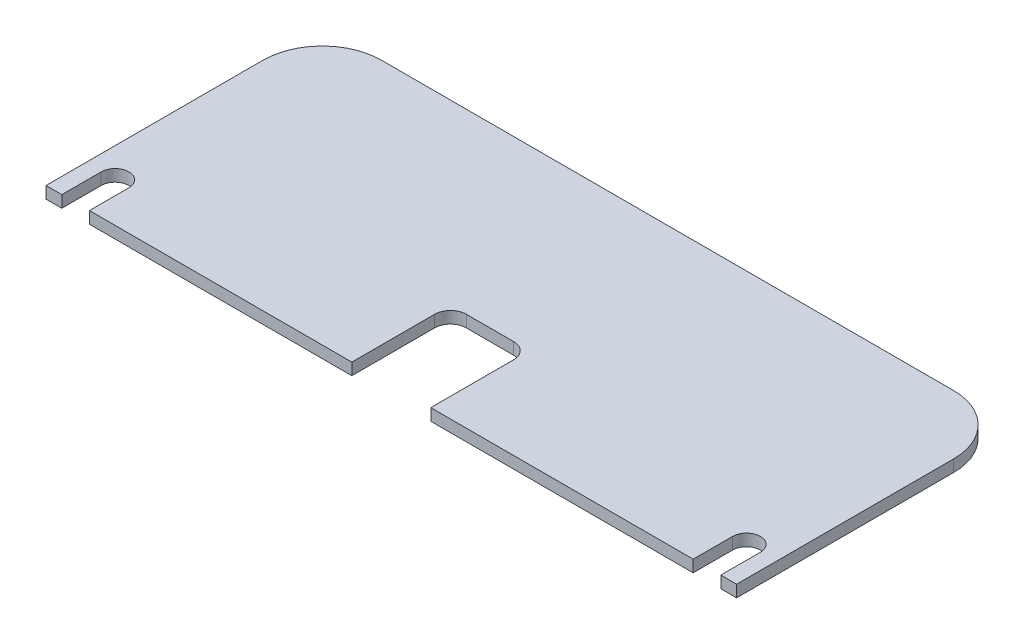
ISO-10303-21;
HEADER;
FILE_DESCRIPTION(('STEP AP214'),'2;1');
FILE_NAME('part.step','',(''),(''),'','','');
FILE_SCHEMA(('AUTOMOTIVE_DESIGN { 1 0 10303 214 1 1 1 1 }'));
ENDSEC;
DATA;
#1=APPLICATION_CONTEXT('core data for automotive mechanical design processes');
#2=APPLICATION_PROTOCOL_DEFINITION('international standard','automotive_design',2000,#1);
#3=PRODUCT_CONTEXT('',#1,'mechanical');
#4=PRODUCT('Part','Part','',(#3));
#5=PRODUCT_RELATED_PRODUCT_CATEGORY('part','',(#4));
#6=PRODUCT_DEFINITION_FORMATION('','',#4);
#7=PRODUCT_DEFINITION_CONTEXT('part definition',#1,'design');
#8=PRODUCT_DEFINITION('design','',#6,#7);
#9=PRODUCT_DEFINITION_SHAPE('','',#8);
#10=(LENGTH_UNIT() NAMED_UNIT(*) SI_UNIT(.MILLI.,.METRE.));
#11=(NAMED_UNIT(*) PLANE_ANGLE_UNIT() SI_UNIT($,.RADIAN.));
#12=(NAMED_UNIT(*) SI_UNIT($,.STERADIAN.) SOLID_ANGLE_UNIT());
#13=UNCERTAINTY_MEASURE_WITH_UNIT(LENGTH_MEASURE(1.E-05),#10,'distance_accuracy_value','');
#14=(GEOMETRIC_REPRESENTATION_CONTEXT(3) GLOBAL_UNCERTAINTY_ASSIGNED_CONTEXT((#13)) GLOBAL_UNIT_ASSIGNED_CONTEXT((#10,
#11,#12)) REPRESENTATION_CONTEXT('',''));
#15=CARTESIAN_POINT('',(0.,0.,0.));
#16=DIRECTION('',(0.,0.,1.));
#17=DIRECTION('',(1.,0.,0.));
#18=AXIS2_PLACEMENT_3D('',#15,#16,#17);
#19=CARTESIAN_POINT('',(0.,3.,0.));
#20=DIRECTION('',(0.,0.,-1.));
#21=DIRECTION('',(-1.,0.,0.));
#22=AXIS2_PLACEMENT_3D('',#19,#20,#21);
#23=PLANE('',#22);
#24=DIRECTION('',(1.,0.,0.));
#25=VECTOR('',#24,1.);
#26=CARTESIAN_POINT('',(0.,3.,0.));
#27=LINE('',#26,#25);
#28=CARTESIAN_POINT('',(171.,3.,0.));
#29=VERTEX_POINT('',#28);
#30=CARTESIAN_POINT('',(175.,3.,0.));
#31=VERTEX_POINT('',#30);
#32=EDGE_CURVE('E237',#29,#31,#27,.T.);
#33=ORIENTED_EDGE('',*,*,#32,.F.);
#34=DIRECTION('',(0.,1.,0.));
#35=VECTOR('',#34,1.);
#36=CARTESIAN_POINT('',(171.,-2.,0.));
#37=LINE('',#36,#35);
#38=CARTESIAN_POINT('',(171.,0.,0.));
#39=VERTEX_POINT('',#38);
#40=EDGE_CURVE('E216',#39,#29,#37,.T.);
#41=ORIENTED_EDGE('',*,*,#40,.F.);
#42=DIRECTION('',(1.,0.,0.));
#43=VECTOR('',#42,1.);
#44=CARTESIAN_POINT('',(0.,0.,0.));
#45=LINE('',#44,#43);
#46=CARTESIAN_POINT('',(175.,0.,0.));
#47=VERTEX_POINT('',#46);
#48=EDGE_CURVE('E247',#39,#47,#45,.T.);
#49=ORIENTED_EDGE('',*,*,#48,.T.);
#50=DIRECTION('',(0.,-1.,0.));
#51=VECTOR('',#50,1.);
#52=CARTESIAN_POINT('',(175.,3.,0.));
#53=LINE('',#52,#51);
#54=EDGE_CURVE('E245',#31,#47,#53,.T.);
#55=ORIENTED_EDGE('',*,*,#54,.F.);
#56=EDGE_LOOP('',(#33,#41,#49,#55));
#57=FACE_BOUND('',#56,.T.);
#58=ADVANCED_FACE('F33',(#57),#23,.F.);
#59=CARTESIAN_POINT('',(11.,3.,0.));
#60=VERTEX_POINT('',#59);
#61=CARTESIAN_POINT('',(77.5,3.,0.));
#62=VERTEX_POINT('',#61);
#63=EDGE_CURVE('E241',#60,#62,#27,.T.);
#64=ORIENTED_EDGE('',*,*,#63,.F.);
#65=DIRECTION('',(0.,1.,0.));
#66=VECTOR('',#65,1.);
#67=CARTESIAN_POINT('',(11.,-2.,0.));
#68=LINE('',#67,#66);
#69=CARTESIAN_POINT('',(11.,0.,0.));
#70=VERTEX_POINT('',#69);
#71=EDGE_CURVE('E203',#70,#60,#68,.T.);
#72=ORIENTED_EDGE('',*,*,#71,.F.);
#73=CARTESIAN_POINT('',(77.5,0.,0.));
#74=VERTEX_POINT('',#73);
#75=EDGE_CURVE('E252',#70,#74,#45,.T.);
#76=ORIENTED_EDGE('',*,*,#75,.T.);
#77=DIRECTION('',(0.,1.,0.));
#78=VECTOR('',#77,1.);
#79=CARTESIAN_POINT('',(77.5,-2.,0.));
#80=LINE('',#79,#78);
#81=EDGE_CURVE('E229',#74,#62,#80,.T.);
#82=ORIENTED_EDGE('',*,*,#81,.T.);
#83=EDGE_LOOP('',(#64,#72,#76,#82));
#84=FACE_BOUND('',#83,.T.);
#85=ADVANCED_FACE('F337',(#84),#23,.F.);
#86=CARTESIAN_POINT('',(0.,0.,0.));
#87=VERTEX_POINT('',#86);
#88=CARTESIAN_POINT('',(3.99999999999999,0.,0.));
#89=VERTEX_POINT('',#88);
#90=EDGE_CURVE('E248',#87,#89,#45,.T.);
#91=ORIENTED_EDGE('',*,*,#90,.T.);
#92=DIRECTION('',(0.,1.,0.));
#93=VECTOR('',#92,1.);
#94=CARTESIAN_POINT('',(3.99999999999999,-2.,0.));
#95=LINE('',#94,#93);
#96=CARTESIAN_POINT('',(3.99999999999999,3.,0.));
#97=VERTEX_POINT('',#96);
#98=EDGE_CURVE('E182',#89,#97,#95,.T.);
#99=ORIENTED_EDGE('',*,*,#98,.T.);
#100=CARTESIAN_POINT('',(0.,3.,0.));
#101=VERTEX_POINT('',#100);
#102=EDGE_CURVE('E197',#101,#97,#27,.T.);
#103=ORIENTED_EDGE('',*,*,#102,.F.);
#104=DIRECTION('',(0.,-1.,0.));
#105=VECTOR('',#104,1.);
#106=CARTESIAN_POINT('',(0.,3.,0.));
#107=LINE('',#106,#105);
#108=EDGE_CURVE('E258',#101,#87,#107,.T.);
#109=ORIENTED_EDGE('',*,*,#108,.T.);
#110=EDGE_LOOP('',(#91,#99,#103,#109));
#111=FACE_BOUND('',#110,.T.);
#112=ADVANCED_FACE('F393',(#111),#23,.F.);
#113=CARTESIAN_POINT('',(0.,3.,0.));
#114=DIRECTION('',(1.,0.,0.));
#115=DIRECTION('',(0.,0.,-1.));
#116=AXIS2_PLACEMENT_3D('',#113,#114,#115);
#117=PLANE('',#116);
#118=DIRECTION('',(0.,0.,1.));
#119=VECTOR('',#118,1.);
#120=CARTESIAN_POINT('',(0.,3.,0.));
#121=LINE('',#120,#119);
#122=CARTESIAN_POINT('',(0.,3.,-55.));
#123=VERTEX_POINT('',#122);
#124=EDGE_CURVE('E235',#123,#101,#121,.T.);
#125=ORIENTED_EDGE('',*,*,#124,.F.);
#126=DIRECTION('',(0.,-1.,0.));
#127=VECTOR('',#126,1.);
#128=CARTESIAN_POINT('',(0.,3.,-55.));
#129=LINE('',#128,#127);
#130=CARTESIAN_POINT('',(0.,0.,-55.));
#131=VERTEX_POINT('',#130);
#132=EDGE_CURVE('E11',#123,#131,#129,.T.);
#133=ORIENTED_EDGE('',*,*,#132,.T.);
#134=DIRECTION('',(0.,0.,1.));
#135=VECTOR('',#134,1.);
#136=CARTESIAN_POINT('',(0.,0.,0.));
#137=LINE('',#136,#135);
#138=EDGE_CURVE('E232',#131,#87,#137,.T.);
#139=ORIENTED_EDGE('',*,*,#138,.T.);
#140=ORIENTED_EDGE('',*,*,#108,.F.);
#141=EDGE_LOOP('',(#125,#133,#139,#140));
#142=FACE_BOUND('',#141,.T.);
#143=ADVANCED_FACE('F397',(#142),#117,.F.);
#144=CARTESIAN_POINT('',(97.5,0.,0.));
#145=VERTEX_POINT('',#144);
#146=CARTESIAN_POINT('',(164.,0.,0.));
#147=VERTEX_POINT('',#146);
#148=EDGE_CURVE('E327',#145,#147,#45,.T.);
#149=ORIENTED_EDGE('',*,*,#148,.T.);
#150=DIRECTION('',(0.,1.,0.));
#151=VECTOR('',#150,1.);
#152=CARTESIAN_POINT('',(164.,-2.,0.));
#153=LINE('',#152,#151);
#154=CARTESIAN_POINT('',(164.,3.,0.));
#155=VERTEX_POINT('',#154);
#156=EDGE_CURVE('E218',#147,#155,#153,.T.);
#157=ORIENTED_EDGE('',*,*,#156,.T.);
#158=CARTESIAN_POINT('',(97.5,3.,0.));
#159=VERTEX_POINT('',#158);
#160=EDGE_CURVE('E365',#159,#155,#27,.T.);
#161=ORIENTED_EDGE('',*,*,#160,.F.);
#162=DIRECTION('',(0.,1.,0.));
#163=VECTOR('',#162,1.);
#164=CARTESIAN_POINT('',(97.5,-2.,0.));
#165=LINE('',#164,#163);
#166=EDGE_CURVE('E230',#145,#159,#165,.T.);
#167=ORIENTED_EDGE('',*,*,#166,.F.);
#168=EDGE_LOOP('',(#149,#157,#161,#167));
#169=FACE_BOUND('',#168,.T.);
#170=ADVANCED_FACE('F364',(#169),#23,.F.);
#171=CARTESIAN_POINT('',(175.,3.,0.));
#172=DIRECTION('',(-1.,0.,0.));
#173=DIRECTION('',(0.,0.,1.));
#174=AXIS2_PLACEMENT_3D('',#171,#172,#173);
#175=PLANE('',#174);
#176=DIRECTION('',(0.,0.,-1.));
#177=VECTOR('',#176,1.);
#178=CARTESIAN_POINT('',(175.,0.,0.));
#179=LINE('',#178,#177);
#180=CARTESIAN_POINT('',(175.,0.,-55.));
#181=VERTEX_POINT('',#180);
#182=EDGE_CURVE('E251',#47,#181,#179,.T.);
#183=ORIENTED_EDGE('',*,*,#182,.T.);
#184=DIRECTION('',(0.,-1.,0.));
#185=VECTOR('',#184,1.);
#186=CARTESIAN_POINT('',(175.,3.,-55.));
#187=LINE('',#186,#185);
#188=CARTESIAN_POINT('',(175.,3.,-55.));
#189=VERTEX_POINT('',#188);
#190=EDGE_CURVE('E56',#181,#189,#187,.F.);
#191=ORIENTED_EDGE('',*,*,#190,.T.);
#192=DIRECTION('',(0.,0.,-1.));
#193=VECTOR('',#192,1.);
#194=CARTESIAN_POINT('',(175.,3.,0.));
#195=LINE('',#194,#193);
#196=EDGE_CURVE('E240',#31,#189,#195,.T.);
#197=ORIENTED_EDGE('',*,*,#196,.F.);
#198=ORIENTED_EDGE('',*,*,#54,.T.);
#199=EDGE_LOOP('',(#183,#191,#197,#198));
#200=FACE_BOUND('',#199,.T.);
#201=ADVANCED_FACE('F321',(#200),#175,.F.);
#202=CARTESIAN_POINT('',(0.,3.,-70.));
#203=DIRECTION('',(0.,0.,1.));
#204=DIRECTION('',(1.,0.,0.));
#205=AXIS2_PLACEMENT_3D('',#202,#203,#204);
#206=PLANE('',#205);
#207=DIRECTION('',(-1.,0.,0.));
#208=VECTOR('',#207,1.);
#209=CARTESIAN_POINT('',(0.,3.,-70.));
#210=LINE('',#209,#208);
#211=CARTESIAN_POINT('',(160.,3.,-70.));
#212=VERTEX_POINT('',#211);
#213=CARTESIAN_POINT('',(15.,3.,-70.));
#214=VERTEX_POINT('',#213);
#215=EDGE_CURVE('E243',#212,#214,#210,.T.);
#216=ORIENTED_EDGE('',*,*,#215,.F.);
#217=DIRECTION('',(0.,-1.,0.));
#218=VECTOR('',#217,1.);
#219=CARTESIAN_POINT('',(160.,3.,-70.));
#220=LINE('',#219,#218);
#221=CARTESIAN_POINT('',(160.,0.,-70.));
#222=VERTEX_POINT('',#221);
#223=EDGE_CURVE('E300',#212,#222,#220,.T.);
#224=ORIENTED_EDGE('',*,*,#223,.T.);
#225=DIRECTION('',(-1.,0.,0.));
#226=VECTOR('',#225,1.);
#227=CARTESIAN_POINT('',(0.,0.,-70.));
#228=LINE('',#227,#226);
#229=CARTESIAN_POINT('',(15.,0.,-70.));
#230=VERTEX_POINT('',#229);
#231=EDGE_CURVE('E238',#222,#230,#228,.T.);
#232=ORIENTED_EDGE('',*,*,#231,.T.);
#233=DIRECTION('',(0.,-1.,0.));
#234=VECTOR('',#233,1.);
#235=CARTESIAN_POINT('',(15.,3.,-70.));
#236=LINE('',#235,#234);
#237=EDGE_CURVE('E298',#230,#214,#236,.F.);
#238=ORIENTED_EDGE('',*,*,#237,.T.);
#239=EDGE_LOOP('',(#216,#224,#232,#238));
#240=FACE_BOUND('',#239,.T.);
#241=ADVANCED_FACE('F313',(#240),#206,.F.);
#242=CARTESIAN_POINT('',(0.,3.,0.));
#243=DIRECTION('',(0.,-1.,0.));
#244=DIRECTION('',(0.,0.,-1.));
#245=AXIS2_PLACEMENT_3D('',#242,#243,#244);
#246=PLANE('',#245);
#247=ORIENTED_EDGE('',*,*,#196,.T.);
#248=CARTESIAN_POINT('',(160.,3.,-55.));
#249=DIRECTION('',(0.,-1.,0.));
#250=DIRECTION('',(0.,0.,-1.));
#251=AXIS2_PLACEMENT_3D('',#248,#249,#250);
#252=CIRCLE('',#251,15.);
#253=EDGE_CURVE('E41',#189,#212,#252,.F.);
#254=ORIENTED_EDGE('',*,*,#253,.T.);
#255=ORIENTED_EDGE('',*,*,#215,.T.);
#256=CARTESIAN_POINT('',(15.,3.,-55.));
#257=DIRECTION('',(0.,-1.,0.));
#258=DIRECTION('',(0.,0.,-1.));
#259=AXIS2_PLACEMENT_3D('',#256,#257,#258);
#260=CIRCLE('',#259,15.);
#261=EDGE_CURVE('E48',#214,#123,#260,.F.);
#262=ORIENTED_EDGE('',*,*,#261,.T.);
#263=ORIENTED_EDGE('',*,*,#124,.T.);
#264=ORIENTED_EDGE('',*,*,#102,.T.);
#265=DIRECTION('',(0.,0.,1.));
#266=VECTOR('',#265,1.);
#267=CARTESIAN_POINT('',(3.99999999999999,3.,0.));
#268=LINE('',#267,#266);
#269=CARTESIAN_POINT('',(3.99999999999999,3.,-10.));
#270=VERTEX_POINT('',#269);
#271=EDGE_CURVE('E176',#270,#97,#268,.T.);
#272=ORIENTED_EDGE('',*,*,#271,.F.);
#273=CARTESIAN_POINT('',(7.50000000000001,3.,-10.));
#274=DIRECTION('',(0.,1.,0.));
#275=DIRECTION('',(0.,0.,-1.));
#276=AXIS2_PLACEMENT_3D('',#273,#274,#275);
#277=CIRCLE('',#276,3.5);
#278=CARTESIAN_POINT('',(11.,3.,-10.));
#279=VERTEX_POINT('',#278);
#280=EDGE_CURVE('E186',#279,#270,#277,.T.);
#281=ORIENTED_EDGE('',*,*,#280,.F.);
#282=DIRECTION('',(0.,0.,-1.));
#283=VECTOR('',#282,1.);
#284=CARTESIAN_POINT('',(11.,3.,-10.));
#285=LINE('',#284,#283);
#286=EDGE_CURVE('E183',#60,#279,#285,.T.);
#287=ORIENTED_EDGE('',*,*,#286,.F.);
#288=ORIENTED_EDGE('',*,*,#63,.T.);
#289=DIRECTION('',(0.,0.,1.));
#290=VECTOR('',#289,1.);
#291=CARTESIAN_POINT('',(77.5,3.,-25.));
#292=LINE('',#291,#290);
#293=CARTESIAN_POINT('',(77.5,3.,-21.));
#294=VERTEX_POINT('',#293);
#295=EDGE_CURVE('E202',#294,#62,#292,.T.);
#296=ORIENTED_EDGE('',*,*,#295,.F.);
#297=CARTESIAN_POINT('',(81.5,3.,-21.));
#298=DIRECTION('',(0.,-1.,0.));
#299=DIRECTION('',(0.,0.,-1.));
#300=AXIS2_PLACEMENT_3D('',#297,#298,#299);
#301=CIRCLE('',#300,4.);
#302=CARTESIAN_POINT('',(81.5,3.,-25.));
#303=VERTEX_POINT('',#302);
#304=EDGE_CURVE('E294',#294,#303,#301,.T.);
#305=ORIENTED_EDGE('',*,*,#304,.T.);
#306=DIRECTION('',(-1.,0.,0.));
#307=VECTOR('',#306,1.);
#308=CARTESIAN_POINT('',(77.5,3.,-25.));
#309=LINE('',#308,#307);
#310=CARTESIAN_POINT('',(93.5,3.,-25.));
#311=VERTEX_POINT('',#310);
#312=EDGE_CURVE('E226',#311,#303,#309,.T.);
#313=ORIENTED_EDGE('',*,*,#312,.F.);
#314=CARTESIAN_POINT('',(93.5,3.,-21.));
#315=DIRECTION('',(0.,-1.,0.));
#316=DIRECTION('',(0.,0.,-1.));
#317=AXIS2_PLACEMENT_3D('',#314,#315,#316);
#318=CIRCLE('',#317,4.);
#319=CARTESIAN_POINT('',(97.5,3.,-21.));
#320=VERTEX_POINT('',#319);
#321=EDGE_CURVE('E290',#311,#320,#318,.T.);
#322=ORIENTED_EDGE('',*,*,#321,.T.);
#323=DIRECTION('',(0.,0.,-1.));
#324=VECTOR('',#323,1.);
#325=CARTESIAN_POINT('',(97.5,3.,-25.));
#326=LINE('',#325,#324);
#327=EDGE_CURVE('E223',#159,#320,#326,.T.);
#328=ORIENTED_EDGE('',*,*,#327,.F.);
#329=ORIENTED_EDGE('',*,*,#160,.T.);
#330=DIRECTION('',(0.,0.,1.));
#331=VECTOR('',#330,1.);
#332=CARTESIAN_POINT('',(164.,3.,-10.));
#333=LINE('',#332,#331);
#334=CARTESIAN_POINT('',(164.,3.,-10.));
#335=VERTEX_POINT('',#334);
#336=EDGE_CURVE('E209',#335,#155,#333,.T.);
#337=ORIENTED_EDGE('',*,*,#336,.F.);
#338=CARTESIAN_POINT('',(167.5,3.,-10.));
#339=DIRECTION('',(0.,1.,0.));
#340=DIRECTION('',(0.,0.,1.));
#341=AXIS2_PLACEMENT_3D('',#338,#339,#340);
#342=CIRCLE('',#341,3.49999999999999);
#343=CARTESIAN_POINT('',(171.,3.,-10.));
#344=VERTEX_POINT('',#343);
#345=EDGE_CURVE('E206',#344,#335,#342,.T.);
#346=ORIENTED_EDGE('',*,*,#345,.F.);
#347=DIRECTION('',(0.,0.,-1.));
#348=VECTOR('',#347,1.);
#349=CARTESIAN_POINT('',(171.,3.,0.));
#350=LINE('',#349,#348);
#351=EDGE_CURVE('E211',#29,#344,#350,.T.);
#352=ORIENTED_EDGE('',*,*,#351,.F.);
#353=ORIENTED_EDGE('',*,*,#32,.T.);
#354=EDGE_LOOP('',(#247,#254,#255,#262,#263,#264,#272,#281,#287,#288,#296,#305,#313,#322,#328,
#329,#337,#346,#352,#353));
#355=FACE_BOUND('',#354,.T.);
#356=ADVANCED_FACE('F195',(#355),#246,.F.);
#357=CARTESIAN_POINT('',(0.,0.,0.));
#358=DIRECTION('',(0.,-1.,0.));
#359=DIRECTION('',(0.,0.,-1.));
#360=AXIS2_PLACEMENT_3D('',#357,#358,#359);
#361=PLANE('',#360);
#362=ORIENTED_EDGE('',*,*,#231,.F.);
#363=CARTESIAN_POINT('',(160.,0.,-55.));
#364=DIRECTION('',(0.,-1.,0.));
#365=DIRECTION('',(0.,0.,-1.));
#366=AXIS2_PLACEMENT_3D('',#363,#364,#365);
#367=CIRCLE('',#366,15.);
#368=EDGE_CURVE('E305',#222,#181,#367,.T.);
#369=ORIENTED_EDGE('',*,*,#368,.T.);
#370=ORIENTED_EDGE('',*,*,#182,.F.);
#371=ORIENTED_EDGE('',*,*,#48,.F.);
#372=DIRECTION('',(0.,0.,1.));
#373=VECTOR('',#372,1.);
#374=CARTESIAN_POINT('',(171.,0.,-9.49240686054507E-13));
#375=LINE('',#374,#373);
#376=CARTESIAN_POINT('',(171.,0.,-10.));
#377=VERTEX_POINT('',#376);
#378=EDGE_CURVE('E278',#377,#39,#375,.T.);
#379=ORIENTED_EDGE('',*,*,#378,.F.);
#380=CARTESIAN_POINT('',(167.5,0.,-10.));
#381=DIRECTION('',(0.,-1.,0.));
#382=DIRECTION('',(0.,0.,-1.));
#383=AXIS2_PLACEMENT_3D('',#380,#381,#382);
#384=CIRCLE('',#383,3.49999999999999);
#385=CARTESIAN_POINT('',(164.,0.,-10.));
#386=VERTEX_POINT('',#385);
#387=EDGE_CURVE('E276',#386,#377,#384,.T.);
#388=ORIENTED_EDGE('',*,*,#387,.F.);
#389=DIRECTION('',(0.,0.,-1.));
#390=VECTOR('',#389,1.);
#391=CARTESIAN_POINT('',(164.,0.,-4.55191440096313E-13));
#392=LINE('',#391,#390);
#393=EDGE_CURVE('E274',#147,#386,#392,.T.);
#394=ORIENTED_EDGE('',*,*,#393,.F.);
#395=ORIENTED_EDGE('',*,*,#148,.F.);
#396=DIRECTION('',(0.,0.,1.));
#397=VECTOR('',#396,1.);
#398=CARTESIAN_POINT('',(97.5,0.,0.));
#399=LINE('',#398,#397);
#400=CARTESIAN_POINT('',(97.5,0.,-21.));
#401=VERTEX_POINT('',#400);
#402=EDGE_CURVE('E261',#401,#145,#399,.T.);
#403=ORIENTED_EDGE('',*,*,#402,.F.);
#404=CARTESIAN_POINT('',(93.5,0.,-21.));
#405=DIRECTION('',(0.,-1.,0.));
#406=DIRECTION('',(0.,0.,-1.));
#407=AXIS2_PLACEMENT_3D('',#404,#405,#406);
#408=CIRCLE('',#407,4.);
#409=CARTESIAN_POINT('',(93.5,0.,-25.));
#410=VERTEX_POINT('',#409);
#411=EDGE_CURVE('E292',#401,#410,#408,.F.);
#412=ORIENTED_EDGE('',*,*,#411,.T.);
#413=DIRECTION('',(1.,0.,0.));
#414=VECTOR('',#413,1.);
#415=CARTESIAN_POINT('',(0.,0.,-25.));
#416=LINE('',#415,#414);
#417=CARTESIAN_POINT('',(81.5,0.,-25.));
#418=VERTEX_POINT('',#417);
#419=EDGE_CURVE('E263',#418,#410,#416,.T.);
#420=ORIENTED_EDGE('',*,*,#419,.F.);
#421=CARTESIAN_POINT('',(81.5,0.,-21.));
#422=DIRECTION('',(0.,-1.,0.));
#423=DIRECTION('',(0.,0.,-1.));
#424=AXIS2_PLACEMENT_3D('',#421,#422,#423);
#425=CIRCLE('',#424,4.);
#426=CARTESIAN_POINT('',(77.5,0.,-21.));
#427=VERTEX_POINT('',#426);
#428=EDGE_CURVE('E296',#418,#427,#425,.F.);
#429=ORIENTED_EDGE('',*,*,#428,.T.);
#430=DIRECTION('',(0.,0.,-1.));
#431=VECTOR('',#430,1.);
#432=CARTESIAN_POINT('',(77.5,0.,0.));
#433=LINE('',#432,#431);
#434=EDGE_CURVE('E266',#74,#427,#433,.T.);
#435=ORIENTED_EDGE('',*,*,#434,.F.);
#436=ORIENTED_EDGE('',*,*,#75,.F.);
#437=DIRECTION('',(0.,0.,1.));
#438=VECTOR('',#437,1.);
#439=CARTESIAN_POINT('',(11.,0.,0.));
#440=LINE('',#439,#438);
#441=CARTESIAN_POINT('',(11.,0.,-10.));
#442=VERTEX_POINT('',#441);
#443=EDGE_CURVE('E272',#442,#70,#440,.T.);
#444=ORIENTED_EDGE('',*,*,#443,.F.);
#445=CARTESIAN_POINT('',(7.50000000000001,0.,-10.));
#446=DIRECTION('',(0.,-1.,0.));
#447=DIRECTION('',(0.,0.,-1.));
#448=AXIS2_PLACEMENT_3D('',#445,#446,#447);
#449=CIRCLE('',#448,3.5);
#450=CARTESIAN_POINT('',(3.99999999999999,0.,-10.));
#451=VERTEX_POINT('',#450);
#452=EDGE_CURVE('E270',#451,#442,#449,.T.);
#453=ORIENTED_EDGE('',*,*,#452,.F.);
#454=DIRECTION('',(0.,0.,-1.));
#455=VECTOR('',#454,1.);
#456=CARTESIAN_POINT('',(3.99999999999999,0.,0.));
#457=LINE('',#456,#455);
#458=EDGE_CURVE('E179',#89,#451,#457,.T.);
#459=ORIENTED_EDGE('',*,*,#458,.F.);
#460=ORIENTED_EDGE('',*,*,#90,.F.);
#461=ORIENTED_EDGE('',*,*,#138,.F.);
#462=CARTESIAN_POINT('',(15.,0.,-55.));
#463=DIRECTION('',(0.,-1.,0.));
#464=DIRECTION('',(0.,0.,-1.));
#465=AXIS2_PLACEMENT_3D('',#462,#463,#464);
#466=CIRCLE('',#465,15.);
#467=EDGE_CURVE('E303',#131,#230,#466,.T.);
#468=ORIENTED_EDGE('',*,*,#467,.T.);
#469=EDGE_LOOP('',(#362,#369,#370,#371,#379,#388,#394,#395,#403,#412,#420,#429,#435,#436,#444,
#453,#459,#460,#461,#468));
#470=FACE_BOUND('',#469,.T.);
#471=ADVANCED_FACE('F319',(#470),#361,.T.);
#472=CARTESIAN_POINT('',(77.5,-2.,-25.));
#473=DIRECTION('',(-1.,0.,0.));
#474=DIRECTION('',(0.,0.,1.));
#475=AXIS2_PLACEMENT_3D('',#472,#473,#474);
#476=PLANE('',#475);
#477=ORIENTED_EDGE('',*,*,#434,.T.);
#478=DIRECTION('',(0.,1.,0.));
#479=VECTOR('',#478,1.);
#480=CARTESIAN_POINT('',(77.5,3.,-21.));
#481=LINE('',#480,#479);
#482=EDGE_CURVE('E287',#427,#294,#481,.T.);
#483=ORIENTED_EDGE('',*,*,#482,.T.);
#484=ORIENTED_EDGE('',*,*,#295,.T.);
#485=ORIENTED_EDGE('',*,*,#81,.F.);
#486=EDGE_LOOP('',(#477,#483,#484,#485));
#487=FACE_BOUND('',#486,.T.);
#488=ADVANCED_FACE('F345',(#487),#476,.F.);
#489=CARTESIAN_POINT('',(77.5,-2.,-25.));
#490=DIRECTION('',(0.,0.,-1.));
#491=DIRECTION('',(-1.,0.,0.));
#492=AXIS2_PLACEMENT_3D('',#489,#490,#491);
#493=PLANE('',#492);
#494=ORIENTED_EDGE('',*,*,#419,.T.);
#495=DIRECTION('',(0.,1.,0.));
#496=VECTOR('',#495,1.);
#497=CARTESIAN_POINT('',(93.5,3.,-25.));
#498=LINE('',#497,#496);
#499=EDGE_CURVE('E282',#410,#311,#498,.T.);
#500=ORIENTED_EDGE('',*,*,#499,.T.);
#501=ORIENTED_EDGE('',*,*,#312,.T.);
#502=DIRECTION('',(0.,1.,0.));
#503=VECTOR('',#502,1.);
#504=CARTESIAN_POINT('',(81.5,0.,-25.));
#505=LINE('',#504,#503);
#506=EDGE_CURVE('E280',#303,#418,#505,.F.);
#507=ORIENTED_EDGE('',*,*,#506,.T.);
#508=EDGE_LOOP('',(#494,#500,#501,#507));
#509=FACE_BOUND('',#508,.T.);
#510=ADVANCED_FACE('F352',(#509),#493,.F.);
#511=CARTESIAN_POINT('',(97.5,-2.,-25.));
#512=DIRECTION('',(1.,0.,0.));
#513=DIRECTION('',(0.,0.,-1.));
#514=AXIS2_PLACEMENT_3D('',#511,#512,#513);
#515=PLANE('',#514);
#516=ORIENTED_EDGE('',*,*,#327,.T.);
#517=DIRECTION('',(0.,1.,0.));
#518=VECTOR('',#517,1.);
#519=CARTESIAN_POINT('',(97.5,0.,-21.));
#520=LINE('',#519,#518);
#521=EDGE_CURVE('E285',#320,#401,#520,.F.);
#522=ORIENTED_EDGE('',*,*,#521,.T.);
#523=ORIENTED_EDGE('',*,*,#402,.T.);
#524=ORIENTED_EDGE('',*,*,#166,.T.);
#525=EDGE_LOOP('',(#516,#522,#523,#524));
#526=FACE_BOUND('',#525,.T.);
#527=ADVANCED_FACE('F362',(#526),#515,.F.);
#528=CARTESIAN_POINT('',(7.50000000000001,-2.,-10.));
#529=DIRECTION('',(0.,1.,0.));
#530=DIRECTION('',(0.,0.,1.));
#531=AXIS2_PLACEMENT_3D('',#528,#529,#530);
#532=CYLINDRICAL_SURFACE('',#531,3.5);
#533=ORIENTED_EDGE('',*,*,#452,.T.);
#534=DIRECTION('',(0.,1.,0.));
#535=VECTOR('',#534,1.);
#536=CARTESIAN_POINT('',(11.,-2.,-10.));
#537=LINE('',#536,#535);
#538=EDGE_CURVE('E189',#442,#279,#537,.T.);
#539=ORIENTED_EDGE('',*,*,#538,.T.);
#540=ORIENTED_EDGE('',*,*,#280,.T.);
#541=DIRECTION('',(0.,1.,0.));
#542=VECTOR('',#541,1.);
#543=CARTESIAN_POINT('',(3.99999999999999,-2.,-10.));
#544=LINE('',#543,#542);
#545=EDGE_CURVE('E172',#451,#270,#544,.T.);
#546=ORIENTED_EDGE('',*,*,#545,.F.);
#547=EDGE_LOOP('',(#533,#539,#540,#546));
#548=FACE_BOUND('',#547,.T.);
#549=ADVANCED_FACE('F187',(#548),#532,.F.);
#550=CARTESIAN_POINT('',(11.,-2.,-10.));
#551=DIRECTION('',(1.,0.,0.));
#552=DIRECTION('',(0.,0.,-1.));
#553=AXIS2_PLACEMENT_3D('',#550,#551,#552);
#554=PLANE('',#553);
#555=ORIENTED_EDGE('',*,*,#443,.T.);
#556=ORIENTED_EDGE('',*,*,#71,.T.);
#557=ORIENTED_EDGE('',*,*,#286,.T.);
#558=ORIENTED_EDGE('',*,*,#538,.F.);
#559=EDGE_LOOP('',(#555,#556,#557,#558));
#560=FACE_BOUND('',#559,.T.);
#561=ADVANCED_FACE('F411',(#560),#554,.F.);
#562=CARTESIAN_POINT('',(3.99999999999999,-2.,0.));
#563=DIRECTION('',(-1.,0.,0.));
#564=DIRECTION('',(0.,0.,1.));
#565=AXIS2_PLACEMENT_3D('',#562,#563,#564);
#566=PLANE('',#565);
#567=ORIENTED_EDGE('',*,*,#458,.T.);
#568=ORIENTED_EDGE('',*,*,#545,.T.);
#569=ORIENTED_EDGE('',*,*,#271,.T.);
#570=ORIENTED_EDGE('',*,*,#98,.F.);
#571=EDGE_LOOP('',(#567,#568,#569,#570));
#572=FACE_BOUND('',#571,.T.);
#573=ADVANCED_FACE('F174',(#572),#566,.F.);
#574=CARTESIAN_POINT('',(167.5,-2.,-10.));
#575=DIRECTION('',(0.,1.,0.));
#576=DIRECTION('',(0.,0.,1.));
#577=AXIS2_PLACEMENT_3D('',#574,#575,#576);
#578=CYLINDRICAL_SURFACE('',#577,3.49999999999999);
#579=ORIENTED_EDGE('',*,*,#387,.T.);
#580=DIRECTION('',(0.,1.,0.));
#581=VECTOR('',#580,1.);
#582=CARTESIAN_POINT('',(171.,-2.,-10.));
#583=LINE('',#582,#581);
#584=EDGE_CURVE('E192',#377,#344,#583,.T.);
#585=ORIENTED_EDGE('',*,*,#584,.T.);
#586=ORIENTED_EDGE('',*,*,#345,.T.);
#587=DIRECTION('',(0.,1.,0.));
#588=VECTOR('',#587,1.);
#589=CARTESIAN_POINT('',(164.,-2.,-10.));
#590=LINE('',#589,#588);
#591=EDGE_CURVE('E214',#386,#335,#590,.T.);
#592=ORIENTED_EDGE('',*,*,#591,.F.);
#593=EDGE_LOOP('',(#579,#585,#586,#592));
#594=FACE_BOUND('',#593,.T.);
#595=ADVANCED_FACE('F372',(#594),#578,.F.);
#596=CARTESIAN_POINT('',(171.,-2.,0.));
#597=DIRECTION('',(1.,0.,0.));
#598=DIRECTION('',(0.,0.,-1.));
#599=AXIS2_PLACEMENT_3D('',#596,#597,#598);
#600=PLANE('',#599);
#601=ORIENTED_EDGE('',*,*,#378,.T.);
#602=ORIENTED_EDGE('',*,*,#40,.T.);
#603=ORIENTED_EDGE('',*,*,#351,.T.);
#604=ORIENTED_EDGE('',*,*,#584,.F.);
#605=EDGE_LOOP('',(#601,#602,#603,#604));
#606=FACE_BOUND('',#605,.T.);
#607=ADVANCED_FACE('F378',(#606),#600,.F.);
#608=CARTESIAN_POINT('',(164.,-2.,-10.));
#609=DIRECTION('',(-1.,0.,0.));
#610=DIRECTION('',(0.,0.,1.));
#611=AXIS2_PLACEMENT_3D('',#608,#609,#610);
#612=PLANE('',#611);
#613=ORIENTED_EDGE('',*,*,#393,.T.);
#614=ORIENTED_EDGE('',*,*,#591,.T.);
#615=ORIENTED_EDGE('',*,*,#336,.T.);
#616=ORIENTED_EDGE('',*,*,#156,.F.);
#617=EDGE_LOOP('',(#613,#614,#615,#616));
#618=FACE_BOUND('',#617,.T.);
#619=ADVANCED_FACE('F370',(#618),#612,.F.);
#620=CARTESIAN_POINT('',(93.5,-2.,-21.));
#621=DIRECTION('',(0.,-1.,0.));
#622=DIRECTION('',(0.,0.,-1.));
#623=AXIS2_PLACEMENT_3D('',#620,#621,#622);
#624=CYLINDRICAL_SURFACE('',#623,4.);
#625=ORIENTED_EDGE('',*,*,#411,.F.);
#626=ORIENTED_EDGE('',*,*,#521,.F.);
#627=ORIENTED_EDGE('',*,*,#321,.F.);
#628=ORIENTED_EDGE('',*,*,#499,.F.);
#629=EDGE_LOOP('',(#625,#626,#627,#628));
#630=FACE_BOUND('',#629,.T.);
#631=ADVANCED_FACE('F356',(#630),#624,.F.);
#632=CARTESIAN_POINT('',(81.5,-2.,-21.));
#633=DIRECTION('',(0.,-1.,0.));
#634=DIRECTION('',(0.,0.,-1.));
#635=AXIS2_PLACEMENT_3D('',#632,#633,#634);
#636=CYLINDRICAL_SURFACE('',#635,4.);
#637=ORIENTED_EDGE('',*,*,#428,.F.);
#638=ORIENTED_EDGE('',*,*,#506,.F.);
#639=ORIENTED_EDGE('',*,*,#304,.F.);
#640=ORIENTED_EDGE('',*,*,#482,.F.);
#641=EDGE_LOOP('',(#637,#638,#639,#640));
#642=FACE_BOUND('',#641,.T.);
#643=ADVANCED_FACE('F348',(#642),#636,.F.);
#644=CARTESIAN_POINT('',(160.,3.,-55.));
#645=DIRECTION('',(0.,-1.,0.));
#646=DIRECTION('',(0.,0.,-1.));
#647=AXIS2_PLACEMENT_3D('',#644,#645,#646);
#648=CYLINDRICAL_SURFACE('',#647,15.);
#649=ORIENTED_EDGE('',*,*,#253,.F.);
#650=ORIENTED_EDGE('',*,*,#190,.F.);
#651=ORIENTED_EDGE('',*,*,#368,.F.);
#652=ORIENTED_EDGE('',*,*,#223,.F.);
#653=EDGE_LOOP('',(#649,#650,#651,#652));
#654=FACE_BOUND('',#653,.T.);
#655=ADVANCED_FACE('F316',(#654),#648,.T.);
#656=CARTESIAN_POINT('',(15.,3.,-55.));
#657=DIRECTION('',(0.,-1.,0.));
#658=DIRECTION('',(0.,0.,-1.));
#659=AXIS2_PLACEMENT_3D('',#656,#657,#658);
#660=CYLINDRICAL_SURFACE('',#659,15.);
#661=ORIENTED_EDGE('',*,*,#261,.F.);
#662=ORIENTED_EDGE('',*,*,#237,.F.);
#663=ORIENTED_EDGE('',*,*,#467,.F.);
#664=ORIENTED_EDGE('',*,*,#132,.F.);
#665=EDGE_LOOP('',(#661,#662,#663,#664));
#666=FACE_BOUND('',#665,.T.);
#667=ADVANCED_FACE('F35',(#666),#660,.T.);
#668=CLOSED_SHELL('',(#58,#85,#112,#143,#170,#201,#241,#356,#471,#488,#510,#527,#549,#561,#573,
#595,#607,#619,#631,#643,#655,#667));
#669=MANIFOLD_SOLID_BREP('B2',#668);
#670=ADVANCED_BREP_SHAPE_REPRESENTATION('',(#18,#669),#14);
#671=SHAPE_DEFINITION_REPRESENTATION(#9,#670);
ENDSEC;
END-ISO-10303-21;
